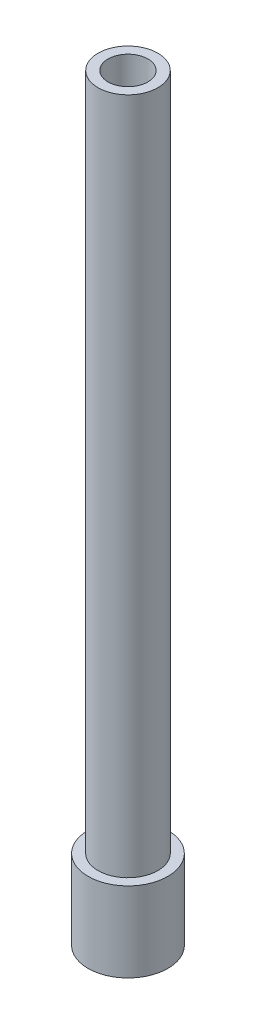
ISO-10303-21;
HEADER;
FILE_DESCRIPTION(('STEP AP214'),'2;1');
FILE_NAME('part.step','',(''),(''),'','','');
FILE_SCHEMA(('AUTOMOTIVE_DESIGN { 1 0 10303 214 1 1 1 1 }'));
ENDSEC;
DATA;
#1=APPLICATION_CONTEXT('core data for automotive mechanical design processes');
#2=APPLICATION_PROTOCOL_DEFINITION('international standard','automotive_design',2000,#1);
#3=PRODUCT_CONTEXT('',#1,'mechanical');
#4=PRODUCT('Part','Part','',(#3));
#5=PRODUCT_RELATED_PRODUCT_CATEGORY('part','',(#4));
#6=PRODUCT_DEFINITION_FORMATION('','',#4);
#7=PRODUCT_DEFINITION_CONTEXT('part definition',#1,'design');
#8=PRODUCT_DEFINITION('design','',#6,#7);
#9=PRODUCT_DEFINITION_SHAPE('','',#8);
#10=(LENGTH_UNIT() NAMED_UNIT(*) SI_UNIT(.MILLI.,.METRE.));
#11=(NAMED_UNIT(*) PLANE_ANGLE_UNIT() SI_UNIT($,.RADIAN.));
#12=(NAMED_UNIT(*) SI_UNIT($,.STERADIAN.) SOLID_ANGLE_UNIT());
#13=UNCERTAINTY_MEASURE_WITH_UNIT(LENGTH_MEASURE(1.E-05),#10,'distance_accuracy_value','');
#14=(GEOMETRIC_REPRESENTATION_CONTEXT(3) GLOBAL_UNCERTAINTY_ASSIGNED_CONTEXT((#13)) GLOBAL_UNIT_ASSIGNED_CONTEXT((#10,
#11,#12)) REPRESENTATION_CONTEXT('',''));
#15=CARTESIAN_POINT('',(0.,0.,0.));
#16=DIRECTION('',(0.,0.,1.));
#17=DIRECTION('',(1.,0.,0.));
#18=AXIS2_PLACEMENT_3D('',#15,#16,#17);
#19=CARTESIAN_POINT('',(0.,6.35,0.));
#20=DIRECTION('',(0.,-1.,0.));
#21=DIRECTION('',(0.,0.,-1.));
#22=AXIS2_PLACEMENT_3D('',#19,#20,#21);
#23=CYLINDRICAL_SURFACE('',#22,3.175);
#24=CARTESIAN_POINT('',(0.,6.35,0.));
#25=DIRECTION('',(0.,1.,0.));
#26=DIRECTION('',(0.,0.,1.));
#27=AXIS2_PLACEMENT_3D('',#24,#25,#26);
#28=CIRCLE('',#27,3.175);
#29=CARTESIAN_POINT('',(0.,6.35,3.175));
#30=VERTEX_POINT('',#29);
#31=EDGE_CURVE('E10',#30,#30,#28,.T.);
#32=ORIENTED_EDGE('',*,*,#31,.F.);
#33=EDGE_LOOP('',(#32));
#34=FACE_BOUND('',#33,.T.);
#35=CARTESIAN_POINT('',(0.,0.,0.));
#36=DIRECTION('',(0.,1.,0.));
#37=DIRECTION('',(0.,0.,1.));
#38=AXIS2_PLACEMENT_3D('',#35,#36,#37);
#39=CIRCLE('',#38,3.175);
#40=CARTESIAN_POINT('',(0.,0.,3.175));
#41=VERTEX_POINT('',#40);
#42=EDGE_CURVE('E36',#41,#41,#39,.T.);
#43=ORIENTED_EDGE('',*,*,#42,.T.);
#44=EDGE_LOOP('',(#43));
#45=FACE_BOUND('',#44,.T.);
#46=ADVANCED_FACE('F33',(#34,#45),#23,.T.);
#47=CARTESIAN_POINT('',(0.,6.35,0.));
#48=DIRECTION('',(0.,1.,0.));
#49=DIRECTION('',(0.,0.,1.));
#50=AXIS2_PLACEMENT_3D('',#47,#48,#49);
#51=PLANE('',#50);
#52=CARTESIAN_POINT('',(0.,6.35,0.));
#53=DIRECTION('',(0.,1.,0.));
#54=DIRECTION('',(0.,0.,1.));
#55=AXIS2_PLACEMENT_3D('',#52,#53,#54);
#56=CIRCLE('',#55,2.38125);
#57=CARTESIAN_POINT('',(0.,6.35,2.38125));
#58=VERTEX_POINT('',#57);
#59=EDGE_CURVE('E45',#58,#58,#56,.T.);
#60=ORIENTED_EDGE('',*,*,#59,.F.);
#61=EDGE_LOOP('',(#60));
#62=FACE_BOUND('',#61,.T.);
#63=ORIENTED_EDGE('',*,*,#31,.T.);
#64=EDGE_LOOP('',(#63));
#65=FACE_BOUND('',#64,.T.);
#66=ADVANCED_FACE('F78',(#62,#65),#51,.T.);
#67=CARTESIAN_POINT('',(0.,0.,0.));
#68=DIRECTION('',(0.,1.,0.));
#69=DIRECTION('',(0.,0.,1.));
#70=AXIS2_PLACEMENT_3D('',#67,#68,#69);
#71=PLANE('',#70);
#72=CARTESIAN_POINT('',(0.,0.,0.));
#73=DIRECTION('',(0.,1.,0.));
#74=DIRECTION('',(0.,0.,1.));
#75=AXIS2_PLACEMENT_3D('',#72,#73,#74);
#76=CIRCLE('',#75,1.5875);
#77=CARTESIAN_POINT('',(0.,0.,1.5875));
#78=VERTEX_POINT('',#77);
#79=EDGE_CURVE('E48',#78,#78,#76,.T.);
#80=ORIENTED_EDGE('',*,*,#79,.T.);
#81=EDGE_LOOP('',(#80));
#82=FACE_BOUND('',#81,.T.);
#83=ORIENTED_EDGE('',*,*,#42,.F.);
#84=EDGE_LOOP('',(#83));
#85=FACE_BOUND('',#84,.T.);
#86=ADVANCED_FACE('F57',(#82,#85),#71,.F.);
#87=CARTESIAN_POINT('',(0.,60.325,0.));
#88=DIRECTION('',(0.,-1.,0.));
#89=DIRECTION('',(0.,0.,-1.));
#90=AXIS2_PLACEMENT_3D('',#87,#88,#89);
#91=CYLINDRICAL_SURFACE('',#90,2.38125);
#92=CARTESIAN_POINT('',(0.,60.325,0.));
#93=DIRECTION('',(0.,1.,0.));
#94=DIRECTION('',(0.,0.,1.));
#95=AXIS2_PLACEMENT_3D('',#92,#93,#94);
#96=CIRCLE('',#95,2.38125);
#97=CARTESIAN_POINT('',(0.,60.325,2.38125));
#98=VERTEX_POINT('',#97);
#99=EDGE_CURVE('E43',#98,#98,#96,.T.);
#100=ORIENTED_EDGE('',*,*,#99,.F.);
#101=EDGE_LOOP('',(#100));
#102=FACE_BOUND('',#101,.T.);
#103=ORIENTED_EDGE('',*,*,#59,.T.);
#104=EDGE_LOOP('',(#103));
#105=FACE_BOUND('',#104,.T.);
#106=ADVANCED_FACE('F69',(#102,#105),#91,.T.);
#107=CARTESIAN_POINT('',(0.,60.325,0.));
#108=DIRECTION('',(0.,1.,0.));
#109=DIRECTION('',(0.,0.,1.));
#110=AXIS2_PLACEMENT_3D('',#107,#108,#109);
#111=PLANE('',#110);
#112=CARTESIAN_POINT('',(0.,60.325,0.));
#113=DIRECTION('',(0.,1.,0.));
#114=DIRECTION('',(0.,0.,1.));
#115=AXIS2_PLACEMENT_3D('',#112,#113,#114);
#116=CIRCLE('',#115,1.5875);
#117=CARTESIAN_POINT('',(0.,60.325,1.5875));
#118=VERTEX_POINT('',#117);
#119=EDGE_CURVE('E51',#118,#118,#116,.T.);
#120=ORIENTED_EDGE('',*,*,#119,.F.);
#121=EDGE_LOOP('',(#120));
#122=FACE_BOUND('',#121,.T.);
#123=ORIENTED_EDGE('',*,*,#99,.T.);
#124=EDGE_LOOP('',(#123));
#125=FACE_BOUND('',#124,.T.);
#126=ADVANCED_FACE('F63',(#122,#125),#111,.T.);
#127=CARTESIAN_POINT('',(0.,0.,0.));
#128=DIRECTION('',(0.,1.,0.));
#129=DIRECTION('',(0.,0.,1.));
#130=AXIS2_PLACEMENT_3D('',#127,#128,#129);
#131=CYLINDRICAL_SURFACE('',#130,1.5875);
#132=CARTESIAN_POINT('',(0.,0.,1.5875));
#133=CARTESIAN_POINT('',(0.,0.628385416666666,1.5875));
#134=CARTESIAN_POINT('',(0.,1.25677083333333,1.5875));
#135=CARTESIAN_POINT('',(0.,2.51354166666667,1.5875));
#136=CARTESIAN_POINT('',(0.,3.14192708333333,1.5875));
#137=CARTESIAN_POINT('',(0.,4.39869791666667,1.5875));
#138=CARTESIAN_POINT('',(0.,5.02708333333333,1.5875));
#139=CARTESIAN_POINT('',(0.,6.28385416666667,1.5875));
#140=CARTESIAN_POINT('',(0.,6.91223958333333,1.5875));
#141=CARTESIAN_POINT('',(0.,8.16901041666667,1.5875));
#142=CARTESIAN_POINT('',(0.,8.79739583333333,1.5875));
#143=CARTESIAN_POINT('',(0.,10.0541666666667,1.5875));
#144=CARTESIAN_POINT('',(0.,10.6825520833333,1.5875));
#145=CARTESIAN_POINT('',(0.,11.9393229166667,1.5875));
#146=CARTESIAN_POINT('',(0.,12.5677083333333,1.5875));
#147=CARTESIAN_POINT('',(0.,13.8244791666667,1.5875));
#148=CARTESIAN_POINT('',(0.,14.4528645833333,1.5875));
#149=CARTESIAN_POINT('',(0.,15.7096354166667,1.5875));
#150=CARTESIAN_POINT('',(0.,16.3380208333333,1.5875));
#151=CARTESIAN_POINT('',(0.,17.5947916666667,1.5875));
#152=CARTESIAN_POINT('',(0.,18.2231770833333,1.5875));
#153=CARTESIAN_POINT('',(0.,19.4799479166667,1.5875));
#154=CARTESIAN_POINT('',(0.,20.1083333333333,1.5875));
#155=CARTESIAN_POINT('',(0.,21.3651041666667,1.5875));
#156=CARTESIAN_POINT('',(0.,21.9934895833333,1.5875));
#157=CARTESIAN_POINT('',(0.,23.2502604166667,1.5875));
#158=CARTESIAN_POINT('',(0.,23.8786458333333,1.5875));
#159=CARTESIAN_POINT('',(0.,25.1354166666667,1.5875));
#160=CARTESIAN_POINT('',(0.,25.7638020833333,1.5875));
#161=CARTESIAN_POINT('',(0.,27.0205729166667,1.5875));
#162=CARTESIAN_POINT('',(0.,27.6489583333333,1.5875));
#163=CARTESIAN_POINT('',(0.,28.9057291666667,1.5875));
#164=CARTESIAN_POINT('',(0.,29.5341145833333,1.5875));
#165=CARTESIAN_POINT('',(0.,30.7908854166667,1.5875));
#166=CARTESIAN_POINT('',(0.,31.4192708333333,1.5875));
#167=CARTESIAN_POINT('',(0.,32.6760416666667,1.5875));
#168=CARTESIAN_POINT('',(0.,33.3044270833333,1.5875));
#169=CARTESIAN_POINT('',(0.,34.5611979166667,1.5875));
#170=CARTESIAN_POINT('',(0.,35.1895833333333,1.5875));
#171=CARTESIAN_POINT('',(0.,36.4463541666667,1.5875));
#172=CARTESIAN_POINT('',(0.,37.0747395833333,1.5875));
#173=CARTESIAN_POINT('',(0.,38.3315104166667,1.5875));
#174=CARTESIAN_POINT('',(0.,38.9598958333333,1.5875));
#175=CARTESIAN_POINT('',(0.,40.2166666666667,1.5875));
#176=CARTESIAN_POINT('',(0.,40.8450520833333,1.5875));
#177=CARTESIAN_POINT('',(0.,42.1018229166667,1.5875));
#178=CARTESIAN_POINT('',(0.,42.7302083333333,1.5875));
#179=CARTESIAN_POINT('',(0.,43.9869791666667,1.5875));
#180=CARTESIAN_POINT('',(0.,44.6153645833333,1.5875));
#181=CARTESIAN_POINT('',(0.,45.8721354166667,1.5875));
#182=CARTESIAN_POINT('',(0.,46.5005208333333,1.5875));
#183=CARTESIAN_POINT('',(0.,47.7572916666667,1.5875));
#184=CARTESIAN_POINT('',(0.,48.3856770833333,1.5875));
#185=CARTESIAN_POINT('',(0.,49.6424479166667,1.5875));
#186=CARTESIAN_POINT('',(0.,50.2708333333333,1.5875));
#187=CARTESIAN_POINT('',(0.,51.5276041666667,1.5875));
#188=CARTESIAN_POINT('',(0.,52.1559895833333,1.5875));
#189=CARTESIAN_POINT('',(0.,53.4127604166667,1.5875));
#190=CARTESIAN_POINT('',(0.,54.0411458333333,1.5875));
#191=CARTESIAN_POINT('',(0.,55.2979166666667,1.5875));
#192=CARTESIAN_POINT('',(0.,55.9263020833333,1.5875));
#193=CARTESIAN_POINT('',(0.,57.1830729166667,1.5875));
#194=CARTESIAN_POINT('',(0.,57.8114583333333,1.5875));
#195=CARTESIAN_POINT('',(0.,59.0682291666667,1.5875));
#196=CARTESIAN_POINT('',(0.,59.6966145833333,1.5875));
#197=CARTESIAN_POINT('',(0.,60.325,1.5875));
#198=B_SPLINE_CURVE_WITH_KNOTS('',3,(#132,#133,#134,#135,#136,#137,#138,#139,#140,#141,#142,
#143,#144,#145,#146,#147,#148,#149,#150,#151,#152,#153,#154,#155,#156,#157,#158,#159,#160,#161,
#162,#163,#164,#165,#166,#167,#168,#169,#170,#171,#172,#173,#174,#175,#176,#177,#178,#179,#180,
#181,#182,#183,#184,#185,#186,#187,#188,#189,#190,#191,#192,#193,#194,#195,#196,#197),
.UNSPECIFIED.,.F.,.F.,(4,2,2,2,2,2,2,2,2,2,2,2,2,2,2,2,2,2,2,2,2,2,2,2,2,2,2,2,2,2,2,2,4),(0.,
1.88515625,3.7703125,5.65546875,7.540625,9.42578125,11.3109375,13.19609375,15.08125,16.96640625,
18.8515625,20.73671875,22.621875,24.50703125,26.3921875,28.27734375,30.1625,32.04765625,
33.9328125,35.81796875,37.703125,39.58828125,41.4734375,43.35859375,45.24375,47.12890625,
49.0140625,50.89921875,52.784375,54.66953125,56.5546875,58.43984375,60.325),.UNSPECIFIED.);
#199=EDGE_CURVE('BSEAM60',#78,#118,#198,.T.);
#200=ORIENTED_EDGE('',*,*,#79,.F.);
#201=ORIENTED_EDGE('',*,*,#119,.T.);
#202=ORIENTED_EDGE('',*,*,#199,.T.);
#203=ORIENTED_EDGE('',*,*,#199,.F.);
#204=EDGE_LOOP('',(#200,#202,#201,#203));
#205=FACE_BOUND('',#204,.T.);
#206=ADVANCED_FACE('F60',(#205),#131,.F.);
#207=CLOSED_SHELL('',(#46,#66,#86,#106,#126,#206));
#208=MANIFOLD_SOLID_BREP('B2',#207);
#209=ADVANCED_BREP_SHAPE_REPRESENTATION('',(#18,#208),#14);
#210=SHAPE_DEFINITION_REPRESENTATION(#9,#209);
ENDSEC;
END-ISO-10303-21;
